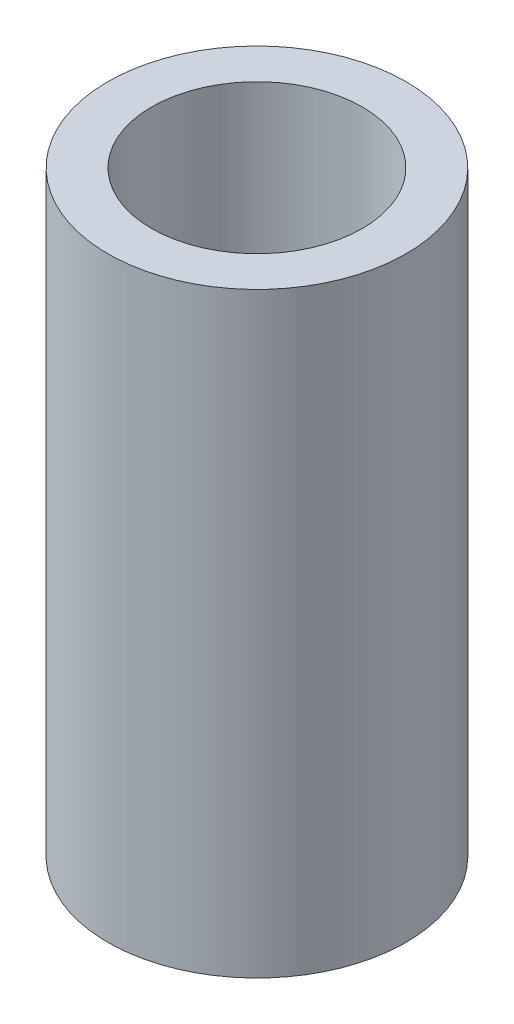
ISO-10303-21;
HEADER;
FILE_DESCRIPTION(('STEP AP214'),'2;1');
FILE_NAME('part.step','',(''),(''),'','','');
FILE_SCHEMA(('AUTOMOTIVE_DESIGN { 1 0 10303 214 1 1 1 1 }'));
ENDSEC;
DATA;
#1=APPLICATION_CONTEXT('core data for automotive mechanical design processes');
#2=APPLICATION_PROTOCOL_DEFINITION('international standard','automotive_design',2000,#1);
#3=PRODUCT_CONTEXT('',#1,'mechanical');
#4=PRODUCT('Part','Part','',(#3));
#5=PRODUCT_RELATED_PRODUCT_CATEGORY('part','',(#4));
#6=PRODUCT_DEFINITION_FORMATION('','',#4);
#7=PRODUCT_DEFINITION_CONTEXT('part definition',#1,'design');
#8=PRODUCT_DEFINITION('design','',#6,#7);
#9=PRODUCT_DEFINITION_SHAPE('','',#8);
#10=(LENGTH_UNIT() NAMED_UNIT(*) SI_UNIT(.MILLI.,.METRE.));
#11=(NAMED_UNIT(*) PLANE_ANGLE_UNIT() SI_UNIT($,.RADIAN.));
#12=(NAMED_UNIT(*) SI_UNIT($,.STERADIAN.) SOLID_ANGLE_UNIT());
#13=UNCERTAINTY_MEASURE_WITH_UNIT(LENGTH_MEASURE(1.E-05),#10,'distance_accuracy_value','');
#14=(GEOMETRIC_REPRESENTATION_CONTEXT(3) GLOBAL_UNCERTAINTY_ASSIGNED_CONTEXT((#13)) GLOBAL_UNIT_ASSIGNED_CONTEXT((#10,
#11,#12)) REPRESENTATION_CONTEXT('',''));
#15=CARTESIAN_POINT('',(0.,0.,0.));
#16=DIRECTION('',(0.,0.,1.));
#17=DIRECTION('',(1.,0.,0.));
#18=AXIS2_PLACEMENT_3D('',#15,#16,#17);
#19=CARTESIAN_POINT('',(0.,19.05,0.));
#20=DIRECTION('',(0.,-1.,0.));
#21=DIRECTION('',(0.,0.,-1.));
#22=AXIS2_PLACEMENT_3D('',#19,#20,#21);
#23=CYLINDRICAL_SURFACE('',#22,3.3655);
#24=CARTESIAN_POINT('',(0.,0.,0.));
#25=DIRECTION('',(0.,-1.,0.));
#26=DIRECTION('',(0.,0.,-1.));
#27=AXIS2_PLACEMENT_3D('',#24,#25,#26);
#28=CIRCLE('',#27,3.3655);
#29=CARTESIAN_POINT('',(0.,0.,-3.3655));
#30=VERTEX_POINT('',#29);
#31=EDGE_CURVE('E27',#30,#30,#28,.T.);
#32=ORIENTED_EDGE('',*,*,#31,.T.);
#33=EDGE_LOOP('',(#32));
#34=FACE_BOUND('',#33,.T.);
#35=CARTESIAN_POINT('',(0.,19.05,0.));
#36=DIRECTION('',(0.,-1.,0.));
#37=DIRECTION('',(0.,0.,-1.));
#38=AXIS2_PLACEMENT_3D('',#35,#36,#37);
#39=CIRCLE('',#38,3.3655);
#40=CARTESIAN_POINT('',(0.,19.05,-3.3655));
#41=VERTEX_POINT('',#40);
#42=EDGE_CURVE('E36',#41,#41,#39,.T.);
#43=ORIENTED_EDGE('',*,*,#42,.F.);
#44=EDGE_LOOP('',(#43));
#45=FACE_BOUND('',#44,.T.);
#46=ADVANCED_FACE('F15',(#34,#45),#23,.F.);
#47=CARTESIAN_POINT('',(0.,19.05,0.));
#48=DIRECTION('',(0.,1.,0.));
#49=DIRECTION('',(0.,0.,1.));
#50=AXIS2_PLACEMENT_3D('',#47,#48,#49);
#51=PLANE('',#50);
#52=ORIENTED_EDGE('',*,*,#42,.T.);
#53=EDGE_LOOP('',(#52));
#54=FACE_BOUND('',#53,.T.);
#55=CARTESIAN_POINT('',(0.,19.05,0.));
#56=DIRECTION('',(0.,-1.,0.));
#57=DIRECTION('',(0.,0.,-1.));
#58=AXIS2_PLACEMENT_3D('',#55,#56,#57);
#59=CIRCLE('',#58,4.7625);
#60=CARTESIAN_POINT('',(0.,19.05,-4.7625));
#61=VERTEX_POINT('',#60);
#62=EDGE_CURVE('E22',#61,#61,#59,.T.);
#63=ORIENTED_EDGE('',*,*,#62,.F.);
#64=EDGE_LOOP('',(#63));
#65=FACE_BOUND('',#64,.T.);
#66=ADVANCED_FACE('F41',(#54,#65),#51,.T.);
#67=CARTESIAN_POINT('',(0.,0.,0.));
#68=DIRECTION('',(0.,1.,0.));
#69=DIRECTION('',(0.,0.,1.));
#70=AXIS2_PLACEMENT_3D('',#67,#68,#69);
#71=PLANE('',#70);
#72=ORIENTED_EDGE('',*,*,#31,.F.);
#73=EDGE_LOOP('',(#72));
#74=FACE_BOUND('',#73,.T.);
#75=CARTESIAN_POINT('',(0.,0.,0.));
#76=DIRECTION('',(0.,-1.,0.));
#77=DIRECTION('',(0.,0.,-1.));
#78=AXIS2_PLACEMENT_3D('',#75,#76,#77);
#79=CIRCLE('',#78,4.7625);
#80=CARTESIAN_POINT('',(0.,0.,-4.7625));
#81=VERTEX_POINT('',#80);
#82=EDGE_CURVE('E10',#81,#81,#79,.F.);
#83=ORIENTED_EDGE('',*,*,#82,.F.);
#84=EDGE_LOOP('',(#83));
#85=FACE_BOUND('',#84,.T.);
#86=ADVANCED_FACE('F50',(#74,#85),#71,.F.);
#87=CARTESIAN_POINT('',(0.,19.05,0.));
#88=DIRECTION('',(0.,-1.,0.));
#89=DIRECTION('',(0.,0.,-1.));
#90=AXIS2_PLACEMENT_3D('',#87,#88,#89);
#91=CYLINDRICAL_SURFACE('',#90,4.7625);
#92=ORIENTED_EDGE('',*,*,#82,.T.);
#93=EDGE_LOOP('',(#92));
#94=FACE_BOUND('',#93,.T.);
#95=ORIENTED_EDGE('',*,*,#62,.T.);
#96=EDGE_LOOP('',(#95));
#97=FACE_BOUND('',#96,.T.);
#98=ADVANCED_FACE('F51',(#94,#97),#91,.T.);
#99=CLOSED_SHELL('',(#46,#66,#86,#98));
#100=MANIFOLD_SOLID_BREP('B1',#99);
#101=ADVANCED_BREP_SHAPE_REPRESENTATION('',(#18,#100),#14);
#102=SHAPE_DEFINITION_REPRESENTATION(#9,#101);
ENDSEC;
END-ISO-10303-21;
